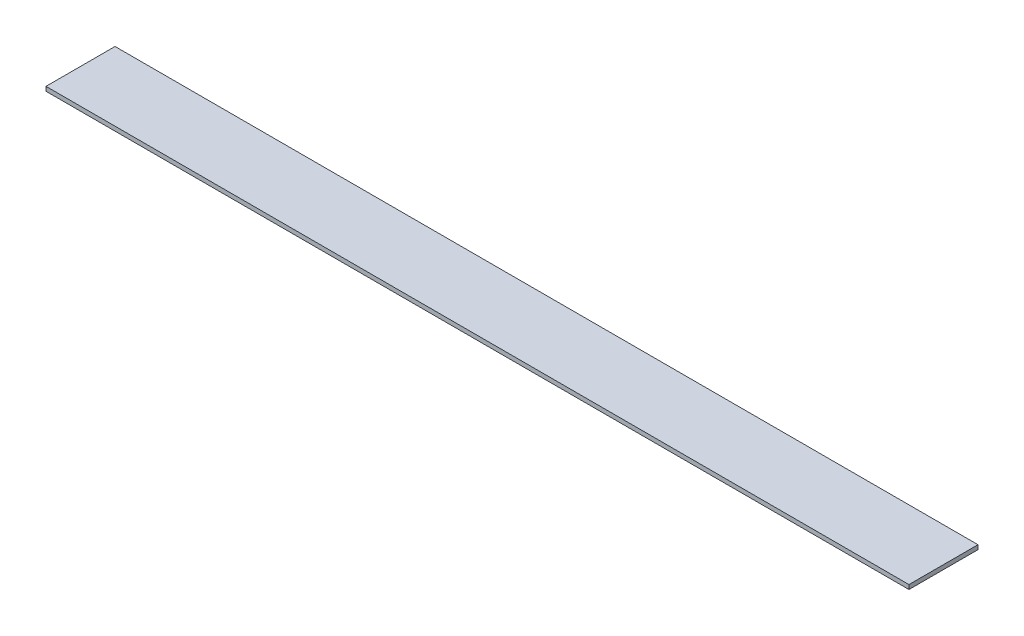
ISO-10303-21;
HEADER;
FILE_DESCRIPTION(('STEP AP214'),'2;1');
FILE_NAME('part.step','',(''),(''),'','','');
FILE_SCHEMA(('AUTOMOTIVE_DESIGN { 1 0 10303 214 1 1 1 1 }'));
ENDSEC;
DATA;
#1=APPLICATION_CONTEXT('core data for automotive mechanical design processes');
#2=APPLICATION_PROTOCOL_DEFINITION('international standard','automotive_design',2000,#1);
#3=PRODUCT_CONTEXT('',#1,'mechanical');
#4=PRODUCT('Part','Part','',(#3));
#5=PRODUCT_RELATED_PRODUCT_CATEGORY('part','',(#4));
#6=PRODUCT_DEFINITION_FORMATION('','',#4);
#7=PRODUCT_DEFINITION_CONTEXT('part definition',#1,'design');
#8=PRODUCT_DEFINITION('design','',#6,#7);
#9=PRODUCT_DEFINITION_SHAPE('','',#8);
#10=(LENGTH_UNIT() NAMED_UNIT(*) SI_UNIT(.MILLI.,.METRE.));
#11=(NAMED_UNIT(*) PLANE_ANGLE_UNIT() SI_UNIT($,.RADIAN.));
#12=(NAMED_UNIT(*) SI_UNIT($,.STERADIAN.) SOLID_ANGLE_UNIT());
#13=UNCERTAINTY_MEASURE_WITH_UNIT(LENGTH_MEASURE(1.E-05),#10,'distance_accuracy_value','');
#14=(GEOMETRIC_REPRESENTATION_CONTEXT(3) GLOBAL_UNCERTAINTY_ASSIGNED_CONTEXT((#13)) GLOBAL_UNIT_ASSIGNED_CONTEXT((#10,
#11,#12)) REPRESENTATION_CONTEXT('',''));
#15=CARTESIAN_POINT('',(0.,0.,0.));
#16=DIRECTION('',(0.,0.,1.));
#17=DIRECTION('',(1.,0.,0.));
#18=AXIS2_PLACEMENT_3D('',#15,#16,#17);
#19=CARTESIAN_POINT('',(0.,1.5875,0.));
#20=DIRECTION('',(1.,0.,0.));
#21=DIRECTION('',(0.,0.,-1.));
#22=AXIS2_PLACEMENT_3D('',#19,#20,#21);
#23=PLANE('',#22);
#24=DIRECTION('',(0.,0.,1.));
#25=VECTOR('',#24,1.);
#26=CARTESIAN_POINT('',(0.,0.,0.));
#27=LINE('',#26,#25);
#28=CARTESIAN_POINT('',(0.,0.,-25.4));
#29=VERTEX_POINT('',#28);
#30=CARTESIAN_POINT('',(0.,0.,0.));
#31=VERTEX_POINT('',#30);
#32=EDGE_CURVE('E91',#29,#31,#27,.T.);
#33=ORIENTED_EDGE('',*,*,#32,.T.);
#34=DIRECTION('',(0.,-1.,0.));
#35=VECTOR('',#34,1.);
#36=CARTESIAN_POINT('',(0.,1.5875,0.));
#37=LINE('',#36,#35);
#38=CARTESIAN_POINT('',(0.,1.5875,0.));
#39=VERTEX_POINT('',#38);
#40=EDGE_CURVE('E11',#39,#31,#37,.T.);
#41=ORIENTED_EDGE('',*,*,#40,.F.);
#42=DIRECTION('',(0.,0.,1.));
#43=VECTOR('',#42,1.);
#44=CARTESIAN_POINT('',(0.,1.5875,0.));
#45=LINE('',#44,#43);
#46=CARTESIAN_POINT('',(0.,1.5875,-25.4));
#47=VERTEX_POINT('',#46);
#48=EDGE_CURVE('E79',#47,#39,#45,.T.);
#49=ORIENTED_EDGE('',*,*,#48,.F.);
#50=DIRECTION('',(0.,-1.,0.));
#51=VECTOR('',#50,1.);
#52=CARTESIAN_POINT('',(0.,1.5875,-25.4));
#53=LINE('',#52,#51);
#54=EDGE_CURVE('E87',#47,#29,#53,.T.);
#55=ORIENTED_EDGE('',*,*,#54,.T.);
#56=EDGE_LOOP('',(#33,#41,#49,#55));
#57=FACE_BOUND('',#56,.T.);
#58=ADVANCED_FACE('F28',(#57),#23,.F.);
#59=CARTESIAN_POINT('',(0.,1.5875,0.));
#60=DIRECTION('',(0.,0.,-1.));
#61=DIRECTION('',(-1.,0.,0.));
#62=AXIS2_PLACEMENT_3D('',#59,#60,#61);
#63=PLANE('',#62);
#64=DIRECTION('',(1.,0.,0.));
#65=VECTOR('',#64,1.);
#66=CARTESIAN_POINT('',(0.,0.,0.));
#67=LINE('',#66,#65);
#68=CARTESIAN_POINT('',(317.5,0.,0.));
#69=VERTEX_POINT('',#68);
#70=EDGE_CURVE('E83',#31,#69,#67,.T.);
#71=ORIENTED_EDGE('',*,*,#70,.T.);
#72=DIRECTION('',(0.,-1.,0.));
#73=VECTOR('',#72,1.);
#74=CARTESIAN_POINT('',(317.5,1.5875,0.));
#75=LINE('',#74,#73);
#76=CARTESIAN_POINT('',(317.5,1.5875,0.));
#77=VERTEX_POINT('',#76);
#78=EDGE_CURVE('E36',#77,#69,#75,.T.);
#79=ORIENTED_EDGE('',*,*,#78,.F.);
#80=DIRECTION('',(1.,0.,0.));
#81=VECTOR('',#80,1.);
#82=CARTESIAN_POINT('',(0.,1.5875,0.));
#83=LINE('',#82,#81);
#84=EDGE_CURVE('E74',#39,#77,#83,.T.);
#85=ORIENTED_EDGE('',*,*,#84,.F.);
#86=ORIENTED_EDGE('',*,*,#40,.T.);
#87=EDGE_LOOP('',(#71,#79,#85,#86));
#88=FACE_BOUND('',#87,.T.);
#89=ADVANCED_FACE('F82',(#88),#63,.F.);
#90=CARTESIAN_POINT('',(317.5,1.5875,0.));
#91=DIRECTION('',(-1.,0.,0.));
#92=DIRECTION('',(0.,0.,1.));
#93=AXIS2_PLACEMENT_3D('',#90,#91,#92);
#94=PLANE('',#93);
#95=DIRECTION('',(0.,0.,-1.));
#96=VECTOR('',#95,1.);
#97=CARTESIAN_POINT('',(317.5,0.,0.));
#98=LINE('',#97,#96);
#99=CARTESIAN_POINT('',(317.5,0.,-25.4));
#100=VERTEX_POINT('',#99);
#101=EDGE_CURVE('E61',#69,#100,#98,.T.);
#102=ORIENTED_EDGE('',*,*,#101,.T.);
#103=DIRECTION('',(0.,-1.,0.));
#104=VECTOR('',#103,1.);
#105=CARTESIAN_POINT('',(317.5,1.5875,-25.4));
#106=LINE('',#105,#104);
#107=CARTESIAN_POINT('',(317.5,1.5875,-25.4));
#108=VERTEX_POINT('',#107);
#109=EDGE_CURVE('E84',#108,#100,#106,.T.);
#110=ORIENTED_EDGE('',*,*,#109,.F.);
#111=DIRECTION('',(0.,0.,-1.));
#112=VECTOR('',#111,1.);
#113=CARTESIAN_POINT('',(317.5,1.5875,0.));
#114=LINE('',#113,#112);
#115=EDGE_CURVE('E77',#77,#108,#114,.T.);
#116=ORIENTED_EDGE('',*,*,#115,.F.);
#117=ORIENTED_EDGE('',*,*,#78,.T.);
#118=EDGE_LOOP('',(#102,#110,#116,#117));
#119=FACE_BOUND('',#118,.T.);
#120=ADVANCED_FACE('F85',(#119),#94,.F.);
#121=CARTESIAN_POINT('',(0.,1.5875,-25.4));
#122=DIRECTION('',(0.,0.,1.));
#123=DIRECTION('',(1.,0.,0.));
#124=AXIS2_PLACEMENT_3D('',#121,#122,#123);
#125=PLANE('',#124);
#126=DIRECTION('',(-1.,0.,0.));
#127=VECTOR('',#126,1.);
#128=CARTESIAN_POINT('',(0.,0.,-25.4));
#129=LINE('',#128,#127);
#130=EDGE_CURVE('E67',#100,#29,#129,.T.);
#131=ORIENTED_EDGE('',*,*,#130,.T.);
#132=ORIENTED_EDGE('',*,*,#54,.F.);
#133=DIRECTION('',(-1.,0.,0.));
#134=VECTOR('',#133,1.);
#135=CARTESIAN_POINT('',(0.,1.5875,-25.4));
#136=LINE('',#135,#134);
#137=EDGE_CURVE('E44',#108,#47,#136,.T.);
#138=ORIENTED_EDGE('',*,*,#137,.F.);
#139=ORIENTED_EDGE('',*,*,#109,.T.);
#140=EDGE_LOOP('',(#131,#132,#138,#139));
#141=FACE_BOUND('',#140,.T.);
#142=ADVANCED_FACE('F98',(#141),#125,.F.);
#143=CARTESIAN_POINT('',(0.,1.5875,0.));
#144=DIRECTION('',(0.,-1.,0.));
#145=DIRECTION('',(0.,0.,-1.));
#146=AXIS2_PLACEMENT_3D('',#143,#144,#145);
#147=PLANE('',#146);
#148=ORIENTED_EDGE('',*,*,#48,.T.);
#149=ORIENTED_EDGE('',*,*,#84,.T.);
#150=ORIENTED_EDGE('',*,*,#115,.T.);
#151=ORIENTED_EDGE('',*,*,#137,.T.);
#152=EDGE_LOOP('',(#148,#149,#150,#151));
#153=FACE_BOUND('',#152,.T.);
#154=ADVANCED_FACE('F75',(#153),#147,.F.);
#155=CARTESIAN_POINT('',(0.,0.,0.));
#156=DIRECTION('',(0.,-1.,0.));
#157=DIRECTION('',(0.,0.,-1.));
#158=AXIS2_PLACEMENT_3D('',#155,#156,#157);
#159=PLANE('',#158);
#160=ORIENTED_EDGE('',*,*,#32,.F.);
#161=ORIENTED_EDGE('',*,*,#130,.F.);
#162=ORIENTED_EDGE('',*,*,#101,.F.);
#163=ORIENTED_EDGE('',*,*,#70,.F.);
#164=EDGE_LOOP('',(#160,#161,#162,#163));
#165=FACE_BOUND('',#164,.T.);
#166=ADVANCED_FACE('F101',(#165),#159,.T.);
#167=CLOSED_SHELL('',(#58,#89,#120,#142,#154,#166));
#168=MANIFOLD_SOLID_BREP('B2',#167);
#169=ADVANCED_BREP_SHAPE_REPRESENTATION('',(#18,#168),#14);
#170=SHAPE_DEFINITION_REPRESENTATION(#9,#169);
ENDSEC;
END-ISO-10303-21;
